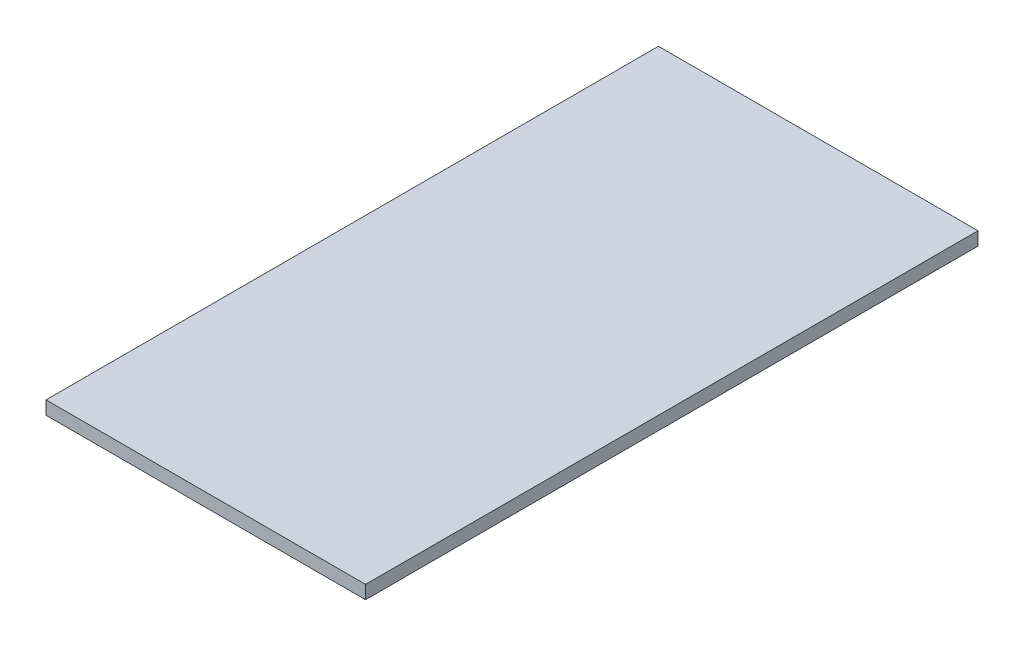
ISO-10303-21;
HEADER;
FILE_DESCRIPTION(('STEP AP214'),'2;1');
FILE_NAME('part.step','',(''),(''),'','','');
FILE_SCHEMA(('AUTOMOTIVE_DESIGN { 1 0 10303 214 1 1 1 1 }'));
ENDSEC;
DATA;
#1=APPLICATION_CONTEXT('core data for automotive mechanical design processes');
#2=APPLICATION_PROTOCOL_DEFINITION('international standard','automotive_design',2000,#1);
#3=PRODUCT_CONTEXT('',#1,'mechanical');
#4=PRODUCT('Part','Part','',(#3));
#5=PRODUCT_RELATED_PRODUCT_CATEGORY('part','',(#4));
#6=PRODUCT_DEFINITION_FORMATION('','',#4);
#7=PRODUCT_DEFINITION_CONTEXT('part definition',#1,'design');
#8=PRODUCT_DEFINITION('design','',#6,#7);
#9=PRODUCT_DEFINITION_SHAPE('','',#8);
#10=(LENGTH_UNIT() NAMED_UNIT(*) SI_UNIT(.MILLI.,.METRE.));
#11=(NAMED_UNIT(*) PLANE_ANGLE_UNIT() SI_UNIT($,.RADIAN.));
#12=(NAMED_UNIT(*) SI_UNIT($,.STERADIAN.) SOLID_ANGLE_UNIT());
#13=UNCERTAINTY_MEASURE_WITH_UNIT(LENGTH_MEASURE(1.E-05),#10,'distance_accuracy_value','');
#14=(GEOMETRIC_REPRESENTATION_CONTEXT(3) GLOBAL_UNCERTAINTY_ASSIGNED_CONTEXT((#13)) GLOBAL_UNIT_ASSIGNED_CONTEXT((#10,
#11,#12)) REPRESENTATION_CONTEXT('',''));
#15=CARTESIAN_POINT('',(0.,0.,0.));
#16=DIRECTION('',(0.,0.,1.));
#17=DIRECTION('',(1.,0.,0.));
#18=AXIS2_PLACEMENT_3D('',#15,#16,#17);
#19=CARTESIAN_POINT('',(0.,3.175,0.));
#20=DIRECTION('',(1.,0.,0.));
#21=DIRECTION('',(0.,0.,-1.));
#22=AXIS2_PLACEMENT_3D('',#19,#20,#21);
#23=PLANE('',#22);
#24=DIRECTION('',(0.,0.,1.));
#25=VECTOR('',#24,1.);
#26=CARTESIAN_POINT('',(0.,0.,0.));
#27=LINE('',#26,#25);
#28=CARTESIAN_POINT('',(0.,0.,-146.05));
#29=VERTEX_POINT('',#28);
#30=CARTESIAN_POINT('',(0.,0.,0.));
#31=VERTEX_POINT('',#30);
#32=EDGE_CURVE('E95',#29,#31,#27,.T.);
#33=ORIENTED_EDGE('',*,*,#32,.T.);
#34=DIRECTION('',(0.,-1.,0.));
#35=VECTOR('',#34,1.);
#36=CARTESIAN_POINT('',(0.,3.175,0.));
#37=LINE('',#36,#35);
#38=CARTESIAN_POINT('',(0.,3.175,0.));
#39=VERTEX_POINT('',#38);
#40=EDGE_CURVE('E11',#39,#31,#37,.T.);
#41=ORIENTED_EDGE('',*,*,#40,.F.);
#42=DIRECTION('',(0.,0.,1.));
#43=VECTOR('',#42,1.);
#44=CARTESIAN_POINT('',(0.,3.175,0.));
#45=LINE('',#44,#43);
#46=CARTESIAN_POINT('',(0.,3.175,-146.05));
#47=VERTEX_POINT('',#46);
#48=EDGE_CURVE('E83',#47,#39,#45,.T.);
#49=ORIENTED_EDGE('',*,*,#48,.F.);
#50=DIRECTION('',(0.,-1.,0.));
#51=VECTOR('',#50,1.);
#52=CARTESIAN_POINT('',(0.,3.175,-146.05));
#53=LINE('',#52,#51);
#54=EDGE_CURVE('E91',#47,#29,#53,.T.);
#55=ORIENTED_EDGE('',*,*,#54,.T.);
#56=EDGE_LOOP('',(#33,#41,#49,#55));
#57=FACE_BOUND('',#56,.T.);
#58=ADVANCED_FACE('F32',(#57),#23,.F.);
#59=CARTESIAN_POINT('',(0.,3.175,0.));
#60=DIRECTION('',(0.,0.,-1.));
#61=DIRECTION('',(-1.,0.,0.));
#62=AXIS2_PLACEMENT_3D('',#59,#60,#61);
#63=PLANE('',#62);
#64=DIRECTION('',(1.,0.,0.));
#65=VECTOR('',#64,1.);
#66=CARTESIAN_POINT('',(0.,0.,0.));
#67=LINE('',#66,#65);
#68=CARTESIAN_POINT('',(76.2,0.,0.));
#69=VERTEX_POINT('',#68);
#70=EDGE_CURVE('E87',#31,#69,#67,.T.);
#71=ORIENTED_EDGE('',*,*,#70,.T.);
#72=DIRECTION('',(0.,-1.,0.));
#73=VECTOR('',#72,1.);
#74=CARTESIAN_POINT('',(76.2,3.175,0.));
#75=LINE('',#74,#73);
#76=CARTESIAN_POINT('',(76.2,3.175,0.));
#77=VERTEX_POINT('',#76);
#78=EDGE_CURVE('E40',#77,#69,#75,.T.);
#79=ORIENTED_EDGE('',*,*,#78,.F.);
#80=DIRECTION('',(1.,0.,0.));
#81=VECTOR('',#80,1.);
#82=CARTESIAN_POINT('',(0.,3.175,0.));
#83=LINE('',#82,#81);
#84=EDGE_CURVE('E78',#39,#77,#83,.T.);
#85=ORIENTED_EDGE('',*,*,#84,.F.);
#86=ORIENTED_EDGE('',*,*,#40,.T.);
#87=EDGE_LOOP('',(#71,#79,#85,#86));
#88=FACE_BOUND('',#87,.T.);
#89=ADVANCED_FACE('F86',(#88),#63,.F.);
#90=CARTESIAN_POINT('',(76.2,3.175,0.));
#91=DIRECTION('',(-1.,0.,0.));
#92=DIRECTION('',(0.,0.,1.));
#93=AXIS2_PLACEMENT_3D('',#90,#91,#92);
#94=PLANE('',#93);
#95=DIRECTION('',(0.,0.,-1.));
#96=VECTOR('',#95,1.);
#97=CARTESIAN_POINT('',(76.2,0.,0.));
#98=LINE('',#97,#96);
#99=CARTESIAN_POINT('',(76.2,0.,-146.05));
#100=VERTEX_POINT('',#99);
#101=EDGE_CURVE('E65',#69,#100,#98,.T.);
#102=ORIENTED_EDGE('',*,*,#101,.T.);
#103=DIRECTION('',(0.,-1.,0.));
#104=VECTOR('',#103,1.);
#105=CARTESIAN_POINT('',(76.2,3.175,-146.05));
#106=LINE('',#105,#104);
#107=CARTESIAN_POINT('',(76.2,3.175,-146.05));
#108=VERTEX_POINT('',#107);
#109=EDGE_CURVE('E88',#108,#100,#106,.T.);
#110=ORIENTED_EDGE('',*,*,#109,.F.);
#111=DIRECTION('',(0.,0.,-1.));
#112=VECTOR('',#111,1.);
#113=CARTESIAN_POINT('',(76.2,3.175,0.));
#114=LINE('',#113,#112);
#115=EDGE_CURVE('E81',#77,#108,#114,.T.);
#116=ORIENTED_EDGE('',*,*,#115,.F.);
#117=ORIENTED_EDGE('',*,*,#78,.T.);
#118=EDGE_LOOP('',(#102,#110,#116,#117));
#119=FACE_BOUND('',#118,.T.);
#120=ADVANCED_FACE('F89',(#119),#94,.F.);
#121=CARTESIAN_POINT('',(0.,3.175,-146.05));
#122=DIRECTION('',(0.,0.,1.));
#123=DIRECTION('',(1.,0.,0.));
#124=AXIS2_PLACEMENT_3D('',#121,#122,#123);
#125=PLANE('',#124);
#126=DIRECTION('',(-1.,0.,0.));
#127=VECTOR('',#126,1.);
#128=CARTESIAN_POINT('',(0.,0.,-146.05));
#129=LINE('',#128,#127);
#130=EDGE_CURVE('E71',#100,#29,#129,.T.);
#131=ORIENTED_EDGE('',*,*,#130,.T.);
#132=ORIENTED_EDGE('',*,*,#54,.F.);
#133=DIRECTION('',(-1.,0.,0.));
#134=VECTOR('',#133,1.);
#135=CARTESIAN_POINT('',(0.,3.175,-146.05));
#136=LINE('',#135,#134);
#137=EDGE_CURVE('E48',#108,#47,#136,.T.);
#138=ORIENTED_EDGE('',*,*,#137,.F.);
#139=ORIENTED_EDGE('',*,*,#109,.T.);
#140=EDGE_LOOP('',(#131,#132,#138,#139));
#141=FACE_BOUND('',#140,.T.);
#142=ADVANCED_FACE('F102',(#141),#125,.F.);
#143=CARTESIAN_POINT('',(0.,3.175,0.));
#144=DIRECTION('',(0.,-1.,0.));
#145=DIRECTION('',(0.,0.,-1.));
#146=AXIS2_PLACEMENT_3D('',#143,#144,#145);
#147=PLANE('',#146);
#148=ORIENTED_EDGE('',*,*,#48,.T.);
#149=ORIENTED_EDGE('',*,*,#84,.T.);
#150=ORIENTED_EDGE('',*,*,#115,.T.);
#151=ORIENTED_EDGE('',*,*,#137,.T.);
#152=EDGE_LOOP('',(#148,#149,#150,#151));
#153=FACE_BOUND('',#152,.T.);
#154=ADVANCED_FACE('F79',(#153),#147,.F.);
#155=CARTESIAN_POINT('',(0.,0.,0.));
#156=DIRECTION('',(0.,-1.,0.));
#157=DIRECTION('',(0.,0.,-1.));
#158=AXIS2_PLACEMENT_3D('',#155,#156,#157);
#159=PLANE('',#158);
#160=ORIENTED_EDGE('',*,*,#32,.F.);
#161=ORIENTED_EDGE('',*,*,#130,.F.);
#162=ORIENTED_EDGE('',*,*,#101,.F.);
#163=ORIENTED_EDGE('',*,*,#70,.F.);
#164=EDGE_LOOP('',(#160,#161,#162,#163));
#165=FACE_BOUND('',#164,.T.);
#166=ADVANCED_FACE('F105',(#165),#159,.T.);
#167=CLOSED_SHELL('',(#58,#89,#120,#142,#154,#166));
#168=MANIFOLD_SOLID_BREP('B2',#167);
#169=ADVANCED_BREP_SHAPE_REPRESENTATION('',(#18,#168),#14);
#170=SHAPE_DEFINITION_REPRESENTATION(#9,#169);
ENDSEC;
END-ISO-10303-21;
